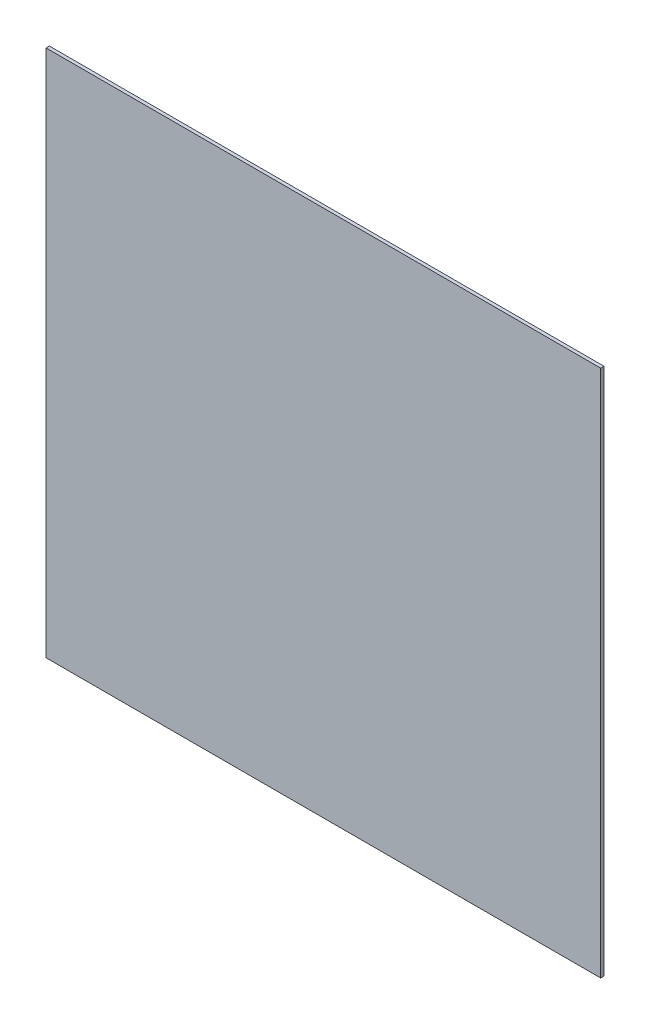
ISO-10303-21;
HEADER;
FILE_DESCRIPTION(('STEP AP214'),'2;1');
FILE_NAME('part.step','',(''),(''),'','','');
FILE_SCHEMA(('AUTOMOTIVE_DESIGN { 1 0 10303 214 1 1 1 1 }'));
ENDSEC;
DATA;
#1=APPLICATION_CONTEXT('core data for automotive mechanical design processes');
#2=APPLICATION_PROTOCOL_DEFINITION('international standard','automotive_design',2000,#1);
#3=PRODUCT_CONTEXT('',#1,'mechanical');
#4=PRODUCT('Part','Part','',(#3));
#5=PRODUCT_RELATED_PRODUCT_CATEGORY('part','',(#4));
#6=PRODUCT_DEFINITION_FORMATION('','',#4);
#7=PRODUCT_DEFINITION_CONTEXT('part definition',#1,'design');
#8=PRODUCT_DEFINITION('design','',#6,#7);
#9=PRODUCT_DEFINITION_SHAPE('','',#8);
#10=(LENGTH_UNIT() NAMED_UNIT(*) SI_UNIT(.MILLI.,.METRE.));
#11=(NAMED_UNIT(*) PLANE_ANGLE_UNIT() SI_UNIT($,.RADIAN.));
#12=(NAMED_UNIT(*) SI_UNIT($,.STERADIAN.) SOLID_ANGLE_UNIT());
#13=UNCERTAINTY_MEASURE_WITH_UNIT(LENGTH_MEASURE(1.E-05),#10,'distance_accuracy_value','');
#14=(GEOMETRIC_REPRESENTATION_CONTEXT(3) GLOBAL_UNCERTAINTY_ASSIGNED_CONTEXT((#13)) GLOBAL_UNIT_ASSIGNED_CONTEXT((#10,
#11,#12)) REPRESENTATION_CONTEXT('',''));
#15=CARTESIAN_POINT('',(0.,0.,0.));
#16=DIRECTION('',(0.,0.,1.));
#17=DIRECTION('',(1.,0.,0.));
#18=AXIS2_PLACEMENT_3D('',#15,#16,#17);
#19=CARTESIAN_POINT('',(0.,0.,3.175));
#20=DIRECTION('',(1.,0.,0.));
#21=DIRECTION('',(0.,0.,-1.));
#22=AXIS2_PLACEMENT_3D('',#19,#20,#21);
#23=PLANE('',#22);
#24=DIRECTION('',(0.,-1.,0.));
#25=VECTOR('',#24,1.);
#26=CARTESIAN_POINT('',(0.,0.,0.));
#27=LINE('',#26,#25);
#28=CARTESIAN_POINT('',(0.,508.,0.));
#29=VERTEX_POINT('',#28);
#30=CARTESIAN_POINT('',(0.,0.,0.));
#31=VERTEX_POINT('',#30);
#32=EDGE_CURVE('E107',#29,#31,#27,.T.);
#33=ORIENTED_EDGE('',*,*,#32,.T.);
#34=DIRECTION('',(0.,0.,-1.));
#35=VECTOR('',#34,1.);
#36=CARTESIAN_POINT('',(0.,0.,3.175));
#37=LINE('',#36,#35);
#38=CARTESIAN_POINT('',(0.,0.,3.175));
#39=VERTEX_POINT('',#38);
#40=EDGE_CURVE('E11',#39,#31,#37,.T.);
#41=ORIENTED_EDGE('',*,*,#40,.F.);
#42=DIRECTION('',(0.,-1.,0.));
#43=VECTOR('',#42,1.);
#44=CARTESIAN_POINT('',(0.,0.,3.175));
#45=LINE('',#44,#43);
#46=CARTESIAN_POINT('',(0.,508.,3.175));
#47=VERTEX_POINT('',#46);
#48=EDGE_CURVE('E91',#47,#39,#45,.T.);
#49=ORIENTED_EDGE('',*,*,#48,.F.);
#50=DIRECTION('',(0.,0.,-1.));
#51=VECTOR('',#50,1.);
#52=CARTESIAN_POINT('',(0.,508.,3.175));
#53=LINE('',#52,#51);
#54=EDGE_CURVE('E103',#47,#29,#53,.T.);
#55=ORIENTED_EDGE('',*,*,#54,.T.);
#56=EDGE_LOOP('',(#33,#41,#49,#55));
#57=FACE_BOUND('',#56,.T.);
#58=ADVANCED_FACE('F39',(#57),#23,.F.);
#59=CARTESIAN_POINT('',(0.,0.,3.175));
#60=DIRECTION('',(0.,1.,0.));
#61=DIRECTION('',(0.,0.,1.));
#62=AXIS2_PLACEMENT_3D('',#59,#60,#61);
#63=PLANE('',#62);
#64=DIRECTION('',(1.,0.,0.));
#65=VECTOR('',#64,1.);
#66=CARTESIAN_POINT('',(0.,0.,0.));
#67=LINE('',#66,#65);
#68=CARTESIAN_POINT('',(533.4,0.,0.));
#69=VERTEX_POINT('',#68);
#70=EDGE_CURVE('E96',#31,#69,#67,.T.);
#71=ORIENTED_EDGE('',*,*,#70,.T.);
#72=DIRECTION('',(0.,0.,-1.));
#73=VECTOR('',#72,1.);
#74=CARTESIAN_POINT('',(533.4,0.,3.175));
#75=LINE('',#74,#73);
#76=CARTESIAN_POINT('',(533.4,0.,3.175));
#77=VERTEX_POINT('',#76);
#78=EDGE_CURVE('E48',#77,#69,#75,.T.);
#79=ORIENTED_EDGE('',*,*,#78,.F.);
#80=DIRECTION('',(1.,0.,0.));
#81=VECTOR('',#80,1.);
#82=CARTESIAN_POINT('',(0.,0.,3.175));
#83=LINE('',#82,#81);
#84=EDGE_CURVE('E86',#39,#77,#83,.T.);
#85=ORIENTED_EDGE('',*,*,#84,.F.);
#86=ORIENTED_EDGE('',*,*,#40,.T.);
#87=EDGE_LOOP('',(#71,#79,#85,#86));
#88=FACE_BOUND('',#87,.T.);
#89=ADVANCED_FACE('F95',(#88),#63,.F.);
#90=CARTESIAN_POINT('',(533.4,0.,3.175));
#91=DIRECTION('',(-1.,0.,0.));
#92=DIRECTION('',(0.,0.,1.));
#93=AXIS2_PLACEMENT_3D('',#90,#91,#92);
#94=PLANE('',#93);
#95=DIRECTION('',(0.,1.,0.));
#96=VECTOR('',#95,1.);
#97=CARTESIAN_POINT('',(533.4,0.,0.));
#98=LINE('',#97,#96);
#99=CARTESIAN_POINT('',(533.4,508.,0.));
#100=VERTEX_POINT('',#99);
#101=EDGE_CURVE('E73',#69,#100,#98,.T.);
#102=ORIENTED_EDGE('',*,*,#101,.T.);
#103=DIRECTION('',(0.,0.,-1.));
#104=VECTOR('',#103,1.);
#105=CARTESIAN_POINT('',(533.4,508.,3.175));
#106=LINE('',#105,#104);
#107=CARTESIAN_POINT('',(533.4,508.,3.175));
#108=VERTEX_POINT('',#107);
#109=EDGE_CURVE('E98',#108,#100,#106,.T.);
#110=ORIENTED_EDGE('',*,*,#109,.F.);
#111=DIRECTION('',(0.,1.,0.));
#112=VECTOR('',#111,1.);
#113=CARTESIAN_POINT('',(533.4,0.,3.175));
#114=LINE('',#113,#112);
#115=EDGE_CURVE('E89',#77,#108,#114,.T.);
#116=ORIENTED_EDGE('',*,*,#115,.F.);
#117=ORIENTED_EDGE('',*,*,#78,.T.);
#118=EDGE_LOOP('',(#102,#110,#116,#117));
#119=FACE_BOUND('',#118,.T.);
#120=ADVANCED_FACE('F99',(#119),#94,.F.);
#121=CARTESIAN_POINT('',(0.,508.,3.175));
#122=DIRECTION('',(0.,-1.,0.));
#123=DIRECTION('',(0.,0.,-1.));
#124=AXIS2_PLACEMENT_3D('',#121,#122,#123);
#125=PLANE('',#124);
#126=DIRECTION('',(-1.,0.,0.));
#127=VECTOR('',#126,1.);
#128=CARTESIAN_POINT('',(0.,508.,0.));
#129=LINE('',#128,#127);
#130=EDGE_CURVE('E79',#100,#29,#129,.T.);
#131=ORIENTED_EDGE('',*,*,#130,.T.);
#132=ORIENTED_EDGE('',*,*,#54,.F.);
#133=DIRECTION('',(-1.,0.,0.));
#134=VECTOR('',#133,1.);
#135=CARTESIAN_POINT('',(0.,508.,3.175));
#136=LINE('',#135,#134);
#137=EDGE_CURVE('E56',#108,#47,#136,.T.);
#138=ORIENTED_EDGE('',*,*,#137,.F.);
#139=ORIENTED_EDGE('',*,*,#109,.T.);
#140=EDGE_LOOP('',(#131,#132,#138,#139));
#141=FACE_BOUND('',#140,.T.);
#142=ADVANCED_FACE('F120',(#141),#125,.F.);
#143=CARTESIAN_POINT('',(0.,0.,3.175));
#144=DIRECTION('',(0.,0.,-1.));
#145=DIRECTION('',(-1.,0.,0.));
#146=AXIS2_PLACEMENT_3D('',#143,#144,#145);
#147=PLANE('',#146);
#148=ORIENTED_EDGE('',*,*,#48,.T.);
#149=ORIENTED_EDGE('',*,*,#84,.T.);
#150=ORIENTED_EDGE('',*,*,#115,.T.);
#151=ORIENTED_EDGE('',*,*,#137,.T.);
#152=EDGE_LOOP('',(#148,#149,#150,#151));
#153=FACE_BOUND('',#152,.T.);
#154=ADVANCED_FACE('F87',(#153),#147,.F.);
#155=CARTESIAN_POINT('',(0.,0.,0.));
#156=DIRECTION('',(0.,0.,-1.));
#157=DIRECTION('',(-1.,0.,0.));
#158=AXIS2_PLACEMENT_3D('',#155,#156,#157);
#159=PLANE('',#158);
#160=ORIENTED_EDGE('',*,*,#32,.F.);
#161=ORIENTED_EDGE('',*,*,#130,.F.);
#162=ORIENTED_EDGE('',*,*,#101,.F.);
#163=ORIENTED_EDGE('',*,*,#70,.F.);
#164=EDGE_LOOP('',(#160,#161,#162,#163));
#165=FACE_BOUND('',#164,.T.);
#166=ADVANCED_FACE('F123',(#165),#159,.T.);
#167=CLOSED_SHELL('',(#58,#89,#120,#142,#154,#166));
#168=MANIFOLD_SOLID_BREP('B2',#167);
#169=ADVANCED_BREP_SHAPE_REPRESENTATION('',(#18,#168),#14);
#170=SHAPE_DEFINITION_REPRESENTATION(#9,#169);
ENDSEC;
END-ISO-10303-21;
